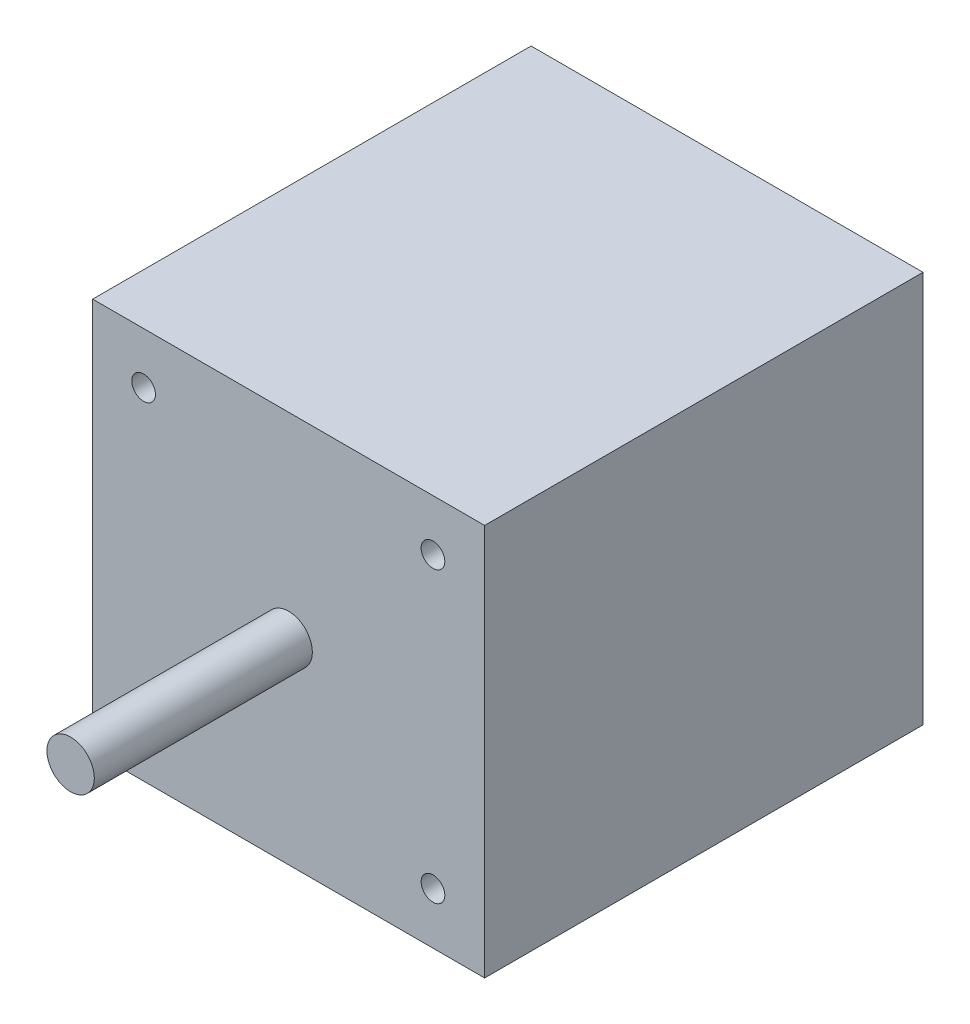
ISO-10303-21;
HEADER;
FILE_DESCRIPTION(('STEP AP214'),'2;1');
FILE_NAME('part.step','',(''),(''),'','','');
FILE_SCHEMA(('AUTOMOTIVE_DESIGN { 1 0 10303 214 1 1 1 1 }'));
ENDSEC;
DATA;
#1=APPLICATION_CONTEXT('core data for automotive mechanical design processes');
#2=APPLICATION_PROTOCOL_DEFINITION('international standard','automotive_design',2000,#1);
#3=PRODUCT_CONTEXT('',#1,'mechanical');
#4=PRODUCT('Part','Part','',(#3));
#5=PRODUCT_RELATED_PRODUCT_CATEGORY('part','',(#4));
#6=PRODUCT_DEFINITION_FORMATION('','',#4);
#7=PRODUCT_DEFINITION_CONTEXT('part definition',#1,'design');
#8=PRODUCT_DEFINITION('design','',#6,#7);
#9=PRODUCT_DEFINITION_SHAPE('','',#8);
#10=(LENGTH_UNIT() NAMED_UNIT(*) SI_UNIT(.MILLI.,.METRE.));
#11=(NAMED_UNIT(*) PLANE_ANGLE_UNIT() SI_UNIT($,.RADIAN.));
#12=(NAMED_UNIT(*) SI_UNIT($,.STERADIAN.) SOLID_ANGLE_UNIT());
#13=UNCERTAINTY_MEASURE_WITH_UNIT(LENGTH_MEASURE(1.E-05),#10,'distance_accuracy_value','');
#14=(GEOMETRIC_REPRESENTATION_CONTEXT(3) GLOBAL_UNCERTAINTY_ASSIGNED_CONTEXT((#13)) GLOBAL_UNIT_ASSIGNED_CONTEXT((#10,
#11,#12)) REPRESENTATION_CONTEXT('',''));
#15=CARTESIAN_POINT('',(0.,0.,0.));
#16=DIRECTION('',(0.,0.,1.));
#17=DIRECTION('',(1.,0.,0.));
#18=AXIS2_PLACEMENT_3D('',#15,#16,#17);
#19=CARTESIAN_POINT('',(0.,0.,23.495));
#20=DIRECTION('',(0.,0.,1.));
#21=DIRECTION('',(1.,0.,0.));
#22=AXIS2_PLACEMENT_3D('',#19,#20,#21);
#23=PLANE('',#22);
#24=CARTESIAN_POINT('',(-15.5448,-15.4678,23.495));
#25=DIRECTION('',(0.,0.,1.));
#26=DIRECTION('',(1.,0.,0.));
#27=AXIS2_PLACEMENT_3D('',#24,#25,#26);
#28=CIRCLE('',#27,1.27);
#29=CARTESIAN_POINT('',(-14.2748,-15.4678,23.495));
#30=VERTEX_POINT('',#29);
#31=EDGE_CURVE('E135',#30,#30,#28,.T.);
#32=ORIENTED_EDGE('',*,*,#31,.F.);
#33=EDGE_LOOP('',(#32));
#34=FACE_BOUND('',#33,.T.);
#35=CARTESIAN_POINT('',(15.4686,15.5186,23.495));
#36=DIRECTION('',(0.,0.,1.));
#37=DIRECTION('',(1.,0.,0.));
#38=AXIS2_PLACEMENT_3D('',#35,#36,#37);
#39=CIRCLE('',#38,1.27);
#40=CARTESIAN_POINT('',(16.7386,15.5186,23.495));
#41=VERTEX_POINT('',#40);
#42=EDGE_CURVE('E129',#41,#41,#39,.T.);
#43=ORIENTED_EDGE('',*,*,#42,.F.);
#44=EDGE_LOOP('',(#43));
#45=FACE_BOUND('',#44,.T.);
#46=CARTESIAN_POINT('',(15.4686,-15.4678,23.495));
#47=DIRECTION('',(0.,0.,1.));
#48=DIRECTION('',(1.,0.,0.));
#49=AXIS2_PLACEMENT_3D('',#46,#47,#48);
#50=CIRCLE('',#49,1.27);
#51=CARTESIAN_POINT('',(16.7386,-15.4678,23.495));
#52=VERTEX_POINT('',#51);
#53=EDGE_CURVE('E123',#52,#52,#50,.T.);
#54=ORIENTED_EDGE('',*,*,#53,.F.);
#55=EDGE_LOOP('',(#54));
#56=FACE_BOUND('',#55,.T.);
#57=CARTESIAN_POINT('',(-15.5448,15.5186,23.495));
#58=DIRECTION('',(0.,0.,1.));
#59=DIRECTION('',(1.,0.,0.));
#60=AXIS2_PLACEMENT_3D('',#57,#58,#59);
#61=CIRCLE('',#60,1.27);
#62=CARTESIAN_POINT('',(-14.2748,15.5186,23.495));
#63=VERTEX_POINT('',#62);
#64=EDGE_CURVE('E117',#63,#63,#61,.T.);
#65=ORIENTED_EDGE('',*,*,#64,.F.);
#66=EDGE_LOOP('',(#65));
#67=FACE_BOUND('',#66,.T.);
#68=DIRECTION('',(0.,1.,0.));
#69=VECTOR('',#68,1.);
#70=CARTESIAN_POINT('',(21.0058,21.005,23.495));
#71=LINE('',#70,#69);
#72=CARTESIAN_POINT('',(21.0058,-21.005,23.495));
#73=VERTEX_POINT('',#72);
#74=CARTESIAN_POINT('',(21.0058,21.005,23.495));
#75=VERTEX_POINT('',#74);
#76=EDGE_CURVE('E85',#73,#75,#71,.T.);
#77=ORIENTED_EDGE('',*,*,#76,.T.);
#78=DIRECTION('',(-1.,0.,0.));
#79=VECTOR('',#78,1.);
#80=CARTESIAN_POINT('',(-21.0058,21.005,23.495));
#81=LINE('',#80,#79);
#82=CARTESIAN_POINT('',(-21.0058,21.005,23.495));
#83=VERTEX_POINT('',#82);
#84=EDGE_CURVE('E80',#75,#83,#81,.T.);
#85=ORIENTED_EDGE('',*,*,#84,.T.);
#86=DIRECTION('',(0.,-1.,0.));
#87=VECTOR('',#86,1.);
#88=CARTESIAN_POINT('',(-21.0058,21.005,23.495));
#89=LINE('',#88,#87);
#90=CARTESIAN_POINT('',(-21.0058,-21.005,23.495));
#91=VERTEX_POINT('',#90);
#92=EDGE_CURVE('E83',#83,#91,#89,.T.);
#93=ORIENTED_EDGE('',*,*,#92,.T.);
#94=DIRECTION('',(1.,0.,0.));
#95=VECTOR('',#94,1.);
#96=CARTESIAN_POINT('',(-21.0058,-21.005,23.495));
#97=LINE('',#96,#95);
#98=EDGE_CURVE('E50',#91,#73,#97,.T.);
#99=ORIENTED_EDGE('',*,*,#98,.T.);
#100=EDGE_LOOP('',(#77,#85,#93,#99));
#101=FACE_BOUND('',#100,.T.);
#102=CARTESIAN_POINT('',(0.,0.,23.495));
#103=DIRECTION('',(0.,0.,1.));
#104=DIRECTION('',(1.,0.,0.));
#105=AXIS2_PLACEMENT_3D('',#102,#103,#104);
#106=CIRCLE('',#105,2.54);
#107=CARTESIAN_POINT('',(2.54,0.,23.495));
#108=VERTEX_POINT('',#107);
#109=EDGE_CURVE('E111',#108,#108,#106,.T.);
#110=ORIENTED_EDGE('',*,*,#109,.F.);
#111=EDGE_LOOP('',(#110));
#112=FACE_BOUND('',#111,.T.);
#113=ADVANCED_FACE('F33',(#34,#45,#56,#67,#101,#112),#23,.T.);
#114=CARTESIAN_POINT('',(21.0058,21.005,23.495));
#115=DIRECTION('',(-1.,0.,0.));
#116=DIRECTION('',(0.,-1.,0.));
#117=AXIS2_PLACEMENT_3D('',#114,#115,#116);
#118=PLANE('',#117);
#119=DIRECTION('',(0.,1.,0.));
#120=VECTOR('',#119,1.);
#121=CARTESIAN_POINT('',(21.0058,21.005,-23.495));
#122=LINE('',#121,#120);
#123=CARTESIAN_POINT('',(21.0058,-21.005,-23.495));
#124=VERTEX_POINT('',#123);
#125=CARTESIAN_POINT('',(21.0058,21.005,-23.495));
#126=VERTEX_POINT('',#125);
#127=EDGE_CURVE('E97',#124,#126,#122,.T.);
#128=ORIENTED_EDGE('',*,*,#127,.T.);
#129=DIRECTION('',(0.,0.,-1.));
#130=VECTOR('',#129,1.);
#131=CARTESIAN_POINT('',(21.0058,21.005,23.495));
#132=LINE('',#131,#130);
#133=EDGE_CURVE('E11',#75,#126,#132,.T.);
#134=ORIENTED_EDGE('',*,*,#133,.F.);
#135=ORIENTED_EDGE('',*,*,#76,.F.);
#136=DIRECTION('',(0.,0.,-1.));
#137=VECTOR('',#136,1.);
#138=CARTESIAN_POINT('',(21.0058,-21.005,23.495));
#139=LINE('',#138,#137);
#140=EDGE_CURVE('E93',#73,#124,#139,.T.);
#141=ORIENTED_EDGE('',*,*,#140,.T.);
#142=EDGE_LOOP('',(#128,#134,#135,#141));
#143=FACE_BOUND('',#142,.T.);
#144=ADVANCED_FACE('F35',(#143),#118,.F.);
#145=CARTESIAN_POINT('',(-21.0058,21.005,23.495));
#146=DIRECTION('',(0.,-1.,0.));
#147=DIRECTION('',(0.,0.,-1.));
#148=AXIS2_PLACEMENT_3D('',#145,#146,#147);
#149=PLANE('',#148);
#150=DIRECTION('',(-1.,0.,0.));
#151=VECTOR('',#150,1.);
#152=CARTESIAN_POINT('',(-21.0058,21.005,-23.495));
#153=LINE('',#152,#151);
#154=CARTESIAN_POINT('',(-21.0058,21.005,-23.495));
#155=VERTEX_POINT('',#154);
#156=EDGE_CURVE('E89',#126,#155,#153,.T.);
#157=ORIENTED_EDGE('',*,*,#156,.T.);
#158=DIRECTION('',(0.,0.,-1.));
#159=VECTOR('',#158,1.);
#160=CARTESIAN_POINT('',(-21.0058,21.005,23.495));
#161=LINE('',#160,#159);
#162=EDGE_CURVE('E42',#83,#155,#161,.T.);
#163=ORIENTED_EDGE('',*,*,#162,.F.);
#164=ORIENTED_EDGE('',*,*,#84,.F.);
#165=ORIENTED_EDGE('',*,*,#133,.T.);
#166=EDGE_LOOP('',(#157,#163,#164,#165));
#167=FACE_BOUND('',#166,.T.);
#168=ADVANCED_FACE('F88',(#167),#149,.F.);
#169=CARTESIAN_POINT('',(-21.0058,21.005,23.495));
#170=DIRECTION('',(1.,0.,0.));
#171=DIRECTION('',(0.,1.,0.));
#172=AXIS2_PLACEMENT_3D('',#169,#170,#171);
#173=PLANE('',#172);
#174=DIRECTION('',(0.,-1.,0.));
#175=VECTOR('',#174,1.);
#176=CARTESIAN_POINT('',(-21.0058,21.005,-23.495));
#177=LINE('',#176,#175);
#178=CARTESIAN_POINT('',(-21.0058,-21.005,-23.495));
#179=VERTEX_POINT('',#178);
#180=EDGE_CURVE('E67',#155,#179,#177,.T.);
#181=ORIENTED_EDGE('',*,*,#180,.T.);
#182=DIRECTION('',(0.,0.,-1.));
#183=VECTOR('',#182,1.);
#184=CARTESIAN_POINT('',(-21.0058,-21.005,23.495));
#185=LINE('',#184,#183);
#186=EDGE_CURVE('E90',#91,#179,#185,.T.);
#187=ORIENTED_EDGE('',*,*,#186,.F.);
#188=ORIENTED_EDGE('',*,*,#92,.F.);
#189=ORIENTED_EDGE('',*,*,#162,.T.);
#190=EDGE_LOOP('',(#181,#187,#188,#189));
#191=FACE_BOUND('',#190,.T.);
#192=ADVANCED_FACE('F91',(#191),#173,.F.);
#193=CARTESIAN_POINT('',(-21.0058,-21.005,23.495));
#194=DIRECTION('',(0.,1.,0.));
#195=DIRECTION('',(0.,0.,1.));
#196=AXIS2_PLACEMENT_3D('',#193,#194,#195);
#197=PLANE('',#196);
#198=DIRECTION('',(1.,0.,0.));
#199=VECTOR('',#198,1.);
#200=CARTESIAN_POINT('',(-21.0058,-21.005,-23.495));
#201=LINE('',#200,#199);
#202=EDGE_CURVE('E73',#179,#124,#201,.T.);
#203=ORIENTED_EDGE('',*,*,#202,.T.);
#204=ORIENTED_EDGE('',*,*,#140,.F.);
#205=ORIENTED_EDGE('',*,*,#98,.F.);
#206=ORIENTED_EDGE('',*,*,#186,.T.);
#207=EDGE_LOOP('',(#203,#204,#205,#206));
#208=FACE_BOUND('',#207,.T.);
#209=ADVANCED_FACE('F105',(#208),#197,.F.);
#210=CARTESIAN_POINT('',(0.,0.,-23.495));
#211=DIRECTION('',(0.,0.,1.));
#212=DIRECTION('',(1.,0.,0.));
#213=AXIS2_PLACEMENT_3D('',#210,#211,#212);
#214=PLANE('',#213);
#215=ORIENTED_EDGE('',*,*,#127,.F.);
#216=ORIENTED_EDGE('',*,*,#202,.F.);
#217=ORIENTED_EDGE('',*,*,#180,.F.);
#218=ORIENTED_EDGE('',*,*,#156,.F.);
#219=EDGE_LOOP('',(#215,#216,#217,#218));
#220=FACE_BOUND('',#219,.T.);
#221=ADVANCED_FACE('F108',(#220),#214,.F.);
#222=CARTESIAN_POINT('',(0.,0.,46.863));
#223=DIRECTION('',(0.,0.,-1.));
#224=DIRECTION('',(-1.,0.,0.));
#225=AXIS2_PLACEMENT_3D('',#222,#223,#224);
#226=CYLINDRICAL_SURFACE('',#225,2.54);
#227=CARTESIAN_POINT('',(0.,0.,46.863));
#228=DIRECTION('',(0.,0.,1.));
#229=DIRECTION('',(1.,0.,0.));
#230=AXIS2_PLACEMENT_3D('',#227,#228,#229);
#231=CIRCLE('',#230,2.54);
#232=CARTESIAN_POINT('',(2.54,0.,46.863));
#233=VERTEX_POINT('',#232);
#234=EDGE_CURVE('E100',#233,#233,#231,.T.);
#235=ORIENTED_EDGE('',*,*,#234,.F.);
#236=EDGE_LOOP('',(#235));
#237=FACE_BOUND('',#236,.T.);
#238=ORIENTED_EDGE('',*,*,#109,.T.);
#239=EDGE_LOOP('',(#238));
#240=FACE_BOUND('',#239,.T.);
#241=ADVANCED_FACE('F172',(#237,#240),#226,.T.);
#242=CARTESIAN_POINT('',(0.,0.,46.863));
#243=DIRECTION('',(0.,0.,1.));
#244=DIRECTION('',(1.,0.,0.));
#245=AXIS2_PLACEMENT_3D('',#242,#243,#244);
#246=PLANE('',#245);
#247=ORIENTED_EDGE('',*,*,#234,.T.);
#248=EDGE_LOOP('',(#247));
#249=FACE_BOUND('',#248,.T.);
#250=ADVANCED_FACE('F162',(#249),#246,.T.);
#251=CARTESIAN_POINT('',(-15.5448,15.5186,17.907));
#252=DIRECTION('',(0.,0.,1.));
#253=DIRECTION('',(1.,0.,0.));
#254=AXIS2_PLACEMENT_3D('',#251,#252,#253);
#255=CYLINDRICAL_SURFACE('',#254,1.27);
#256=CARTESIAN_POINT('',(-15.5448,15.5186,17.907));
#257=DIRECTION('',(0.,0.,1.));
#258=DIRECTION('',(1.,0.,0.));
#259=AXIS2_PLACEMENT_3D('',#256,#257,#258);
#260=CIRCLE('',#259,1.27);
#261=CARTESIAN_POINT('',(-14.2748,15.5186,17.907));
#262=VERTEX_POINT('',#261);
#263=EDGE_CURVE('E114',#262,#262,#260,.T.);
#264=ORIENTED_EDGE('',*,*,#263,.F.);
#265=EDGE_LOOP('',(#264));
#266=FACE_BOUND('',#265,.T.);
#267=ORIENTED_EDGE('',*,*,#64,.T.);
#268=EDGE_LOOP('',(#267));
#269=FACE_BOUND('',#268,.T.);
#270=ADVANCED_FACE('F159',(#266,#269),#255,.F.);
#271=CARTESIAN_POINT('',(-15.5448,15.5186,17.907));
#272=DIRECTION('',(0.,0.,1.));
#273=DIRECTION('',(1.,0.,0.));
#274=AXIS2_PLACEMENT_3D('',#271,#272,#273);
#275=PLANE('',#274);
#276=ORIENTED_EDGE('',*,*,#263,.T.);
#277=EDGE_LOOP('',(#276));
#278=FACE_BOUND('',#277,.T.);
#279=ADVANCED_FACE('F161',(#278),#275,.T.);
#280=CARTESIAN_POINT('',(15.4686,-15.4678,17.907));
#281=DIRECTION('',(0.,0.,1.));
#282=DIRECTION('',(1.,0.,0.));
#283=AXIS2_PLACEMENT_3D('',#280,#281,#282);
#284=CYLINDRICAL_SURFACE('',#283,1.27);
#285=CARTESIAN_POINT('',(15.4686,-15.4678,17.907));
#286=DIRECTION('',(0.,0.,1.));
#287=DIRECTION('',(1.,0.,0.));
#288=AXIS2_PLACEMENT_3D('',#285,#286,#287);
#289=CIRCLE('',#288,1.27);
#290=CARTESIAN_POINT('',(16.7386,-15.4678,17.907));
#291=VERTEX_POINT('',#290);
#292=EDGE_CURVE('E120',#291,#291,#289,.T.);
#293=ORIENTED_EDGE('',*,*,#292,.F.);
#294=EDGE_LOOP('',(#293));
#295=FACE_BOUND('',#294,.T.);
#296=ORIENTED_EDGE('',*,*,#53,.T.);
#297=EDGE_LOOP('',(#296));
#298=FACE_BOUND('',#297,.T.);
#299=ADVANCED_FACE('F169',(#295,#298),#284,.F.);
#300=CARTESIAN_POINT('',(15.4686,-15.4678,17.907));
#301=DIRECTION('',(0.,0.,1.));
#302=DIRECTION('',(1.,0.,0.));
#303=AXIS2_PLACEMENT_3D('',#300,#301,#302);
#304=PLANE('',#303);
#305=ORIENTED_EDGE('',*,*,#292,.T.);
#306=EDGE_LOOP('',(#305));
#307=FACE_BOUND('',#306,.T.);
#308=ADVANCED_FACE('F221',(#307),#304,.T.);
#309=CARTESIAN_POINT('',(15.4686,15.5186,17.907));
#310=DIRECTION('',(0.,0.,1.));
#311=DIRECTION('',(1.,0.,0.));
#312=AXIS2_PLACEMENT_3D('',#309,#310,#311);
#313=CYLINDRICAL_SURFACE('',#312,1.27);
#314=CARTESIAN_POINT('',(15.4686,15.5186,17.907));
#315=DIRECTION('',(0.,0.,1.));
#316=DIRECTION('',(1.,0.,0.));
#317=AXIS2_PLACEMENT_3D('',#314,#315,#316);
#318=CIRCLE('',#317,1.27);
#319=CARTESIAN_POINT('',(16.7386,15.5186,17.907));
#320=VERTEX_POINT('',#319);
#321=EDGE_CURVE('E126',#320,#320,#318,.T.);
#322=ORIENTED_EDGE('',*,*,#321,.F.);
#323=EDGE_LOOP('',(#322));
#324=FACE_BOUND('',#323,.T.);
#325=ORIENTED_EDGE('',*,*,#42,.T.);
#326=EDGE_LOOP('',(#325));
#327=FACE_BOUND('',#326,.T.);
#328=ADVANCED_FACE('F230',(#324,#327),#313,.F.);
#329=CARTESIAN_POINT('',(15.4686,15.5186,17.907));
#330=DIRECTION('',(0.,0.,1.));
#331=DIRECTION('',(1.,0.,0.));
#332=AXIS2_PLACEMENT_3D('',#329,#330,#331);
#333=PLANE('',#332);
#334=ORIENTED_EDGE('',*,*,#321,.T.);
#335=EDGE_LOOP('',(#334));
#336=FACE_BOUND('',#335,.T.);
#337=ADVANCED_FACE('F146',(#336),#333,.T.);
#338=CARTESIAN_POINT('',(-15.5448,-15.4678,17.907));
#339=DIRECTION('',(0.,0.,1.));
#340=DIRECTION('',(1.,0.,0.));
#341=AXIS2_PLACEMENT_3D('',#338,#339,#340);
#342=CYLINDRICAL_SURFACE('',#341,1.27);
#343=CARTESIAN_POINT('',(-15.5448,-15.4678,17.907));
#344=DIRECTION('',(0.,0.,1.));
#345=DIRECTION('',(1.,0.,0.));
#346=AXIS2_PLACEMENT_3D('',#343,#344,#345);
#347=CIRCLE('',#346,1.27);
#348=CARTESIAN_POINT('',(-14.2748,-15.4678,17.907));
#349=VERTEX_POINT('',#348);
#350=EDGE_CURVE('E132',#349,#349,#347,.T.);
#351=ORIENTED_EDGE('',*,*,#350,.F.);
#352=EDGE_LOOP('',(#351));
#353=FACE_BOUND('',#352,.T.);
#354=ORIENTED_EDGE('',*,*,#31,.T.);
#355=EDGE_LOOP('',(#354));
#356=FACE_BOUND('',#355,.T.);
#357=ADVANCED_FACE('F143',(#353,#356),#342,.F.);
#358=CARTESIAN_POINT('',(-15.5448,-15.4678,17.907));
#359=DIRECTION('',(0.,0.,1.));
#360=DIRECTION('',(1.,0.,0.));
#361=AXIS2_PLACEMENT_3D('',#358,#359,#360);
#362=PLANE('',#361);
#363=ORIENTED_EDGE('',*,*,#350,.T.);
#364=EDGE_LOOP('',(#363));
#365=FACE_BOUND('',#364,.T.);
#366=ADVANCED_FACE('F141',(#365),#362,.T.);
#367=CLOSED_SHELL('',(#113,#144,#168,#192,#209,#221,#241,#250,#270,#279,#299,#308,#328,#337,
#357,#366));
#368=MANIFOLD_SOLID_BREP('B2',#367);
#369=ADVANCED_BREP_SHAPE_REPRESENTATION('',(#18,#368),#14);
#370=SHAPE_DEFINITION_REPRESENTATION(#9,#369);
ENDSEC;
END-ISO-10303-21;
